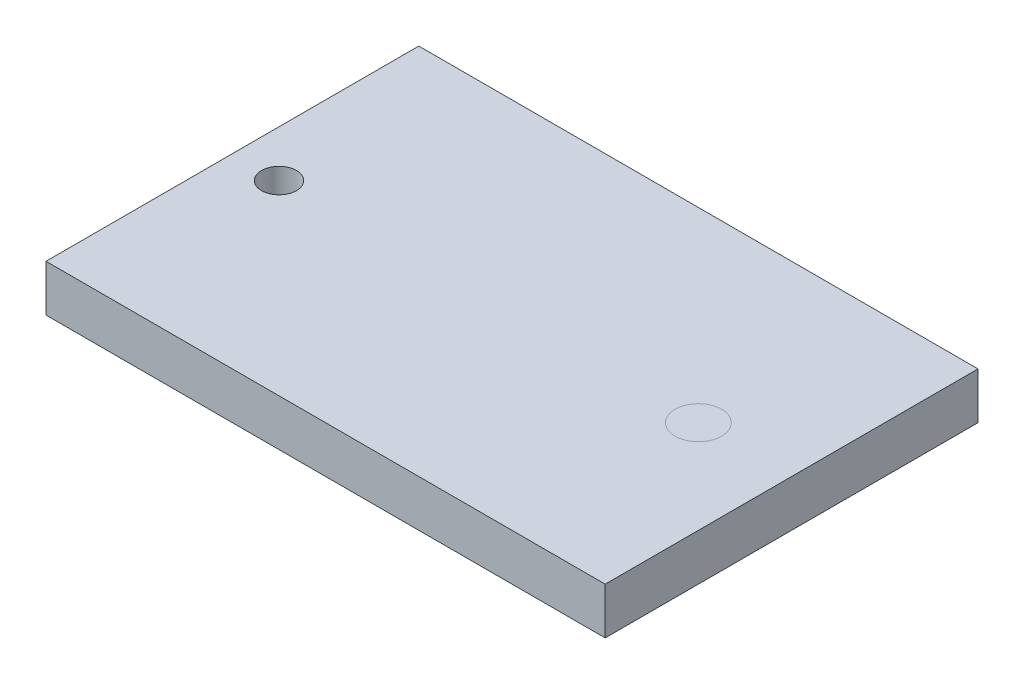
ISO-10303-21;
HEADER;
FILE_DESCRIPTION(('STEP AP214'),'2;1');
FILE_NAME('part.step','',(''),(''),'','','');
FILE_SCHEMA(('AUTOMOTIVE_DESIGN { 1 0 10303 214 1 1 1 1 }'));
ENDSEC;
DATA;
#1=APPLICATION_CONTEXT('core data for automotive mechanical design processes');
#2=APPLICATION_PROTOCOL_DEFINITION('international standard','automotive_design',2000,#1);
#3=PRODUCT_CONTEXT('',#1,'mechanical');
#4=PRODUCT('Part','Part','',(#3));
#5=PRODUCT_RELATED_PRODUCT_CATEGORY('part','',(#4));
#6=PRODUCT_DEFINITION_FORMATION('','',#4);
#7=PRODUCT_DEFINITION_CONTEXT('part definition',#1,'design');
#8=PRODUCT_DEFINITION('design','',#6,#7);
#9=PRODUCT_DEFINITION_SHAPE('','',#8);
#10=(LENGTH_UNIT() NAMED_UNIT(*) SI_UNIT(.MILLI.,.METRE.));
#11=(NAMED_UNIT(*) PLANE_ANGLE_UNIT() SI_UNIT($,.RADIAN.));
#12=(NAMED_UNIT(*) SI_UNIT($,.STERADIAN.) SOLID_ANGLE_UNIT());
#13=UNCERTAINTY_MEASURE_WITH_UNIT(LENGTH_MEASURE(1.E-05),#10,'distance_accuracy_value','');
#14=(GEOMETRIC_REPRESENTATION_CONTEXT(3) GLOBAL_UNCERTAINTY_ASSIGNED_CONTEXT((#13)) GLOBAL_UNIT_ASSIGNED_CONTEXT((#10,
#11,#12)) REPRESENTATION_CONTEXT('',''));
#15=CARTESIAN_POINT('',(0.,0.,0.));
#16=DIRECTION('',(0.,0.,1.));
#17=DIRECTION('',(1.,0.,0.));
#18=AXIS2_PLACEMENT_3D('',#15,#16,#17);
#19=CARTESIAN_POINT('',(0.,6.35,0.));
#20=DIRECTION('',(0.,1.,0.));
#21=DIRECTION('',(0.,0.,1.));
#22=AXIS2_PLACEMENT_3D('',#19,#20,#21);
#23=PLANE('',#22);
#24=DIRECTION('',(0.,0.,1.));
#25=VECTOR('',#24,1.);
#26=CARTESIAN_POINT('',(38.1,6.35,0.));
#27=LINE('',#26,#25);
#28=CARTESIAN_POINT('',(38.1,6.35,-25.4));
#29=VERTEX_POINT('',#28);
#30=CARTESIAN_POINT('',(38.1,6.35,25.4));
#31=VERTEX_POINT('',#30);
#32=EDGE_CURVE('E117',#29,#31,#27,.T.);
#33=ORIENTED_EDGE('',*,*,#32,.F.);
#34=DIRECTION('',(1.,0.,0.));
#35=VECTOR('',#34,1.);
#36=CARTESIAN_POINT('',(0.,6.35,-25.4));
#37=LINE('',#36,#35);
#38=CARTESIAN_POINT('',(-38.1,6.35,-25.4));
#39=VERTEX_POINT('',#38);
#40=EDGE_CURVE('E103',#39,#29,#37,.T.);
#41=ORIENTED_EDGE('',*,*,#40,.F.);
#42=DIRECTION('',(0.,0.,1.));
#43=VECTOR('',#42,1.);
#44=CARTESIAN_POINT('',(-38.1,6.35,0.));
#45=LINE('',#44,#43);
#46=CARTESIAN_POINT('',(-38.1,6.35,25.4));
#47=VERTEX_POINT('',#46);
#48=EDGE_CURVE('E112',#39,#47,#45,.T.);
#49=ORIENTED_EDGE('',*,*,#48,.T.);
#50=DIRECTION('',(1.,0.,0.));
#51=VECTOR('',#50,1.);
#52=CARTESIAN_POINT('',(0.,6.35,25.4));
#53=LINE('',#52,#51);
#54=EDGE_CURVE('E68',#47,#31,#53,.T.);
#55=ORIENTED_EDGE('',*,*,#54,.T.);
#56=EDGE_LOOP('',(#33,#41,#49,#55));
#57=FACE_BOUND('',#56,.T.);
#58=CARTESIAN_POINT('',(-31.75,6.35,0.));
#59=DIRECTION('',(0.,1.,0.));
#60=DIRECTION('',(0.,0.,1.));
#61=AXIS2_PLACEMENT_3D('',#58,#59,#60);
#62=CIRCLE('',#61,2.38125);
#63=CARTESIAN_POINT('',(-31.75,6.35,2.38125));
#64=VERTEX_POINT('',#63);
#65=EDGE_CURVE('E121',#64,#64,#62,.T.);
#66=ORIENTED_EDGE('',*,*,#65,.F.);
#67=EDGE_LOOP('',(#66));
#68=FACE_BOUND('',#67,.T.);
#69=CARTESIAN_POINT('',(25.4,6.35,0.));
#70=DIRECTION('',(0.,1.,0.));
#71=DIRECTION('',(0.,0.,1.));
#72=AXIS2_PLACEMENT_3D('',#69,#70,#71);
#73=CIRCLE('',#72,3.175);
#74=CARTESIAN_POINT('',(25.4,6.35,3.175));
#75=VERTEX_POINT('',#74);
#76=EDGE_CURVE('E12',#75,#75,#73,.F.);
#77=ORIENTED_EDGE('',*,*,#76,.T.);
#78=EDGE_LOOP('',(#77));
#79=FACE_BOUND('',#78,.T.);
#80=ADVANCED_FACE('F50',(#57,#68,#79),#23,.T.);
#81=CARTESIAN_POINT('',(38.1,6.35,0.));
#82=DIRECTION('',(1.,0.,0.));
#83=DIRECTION('',(0.,0.,-1.));
#84=AXIS2_PLACEMENT_3D('',#81,#82,#83);
#85=PLANE('',#84);
#86=DIRECTION('',(0.,0.,1.));
#87=VECTOR('',#86,1.);
#88=CARTESIAN_POINT('',(38.1,0.,0.));
#89=LINE('',#88,#87);
#90=CARTESIAN_POINT('',(38.1,0.,-25.4));
#91=VERTEX_POINT('',#90);
#92=CARTESIAN_POINT('',(38.1,0.,25.4));
#93=VERTEX_POINT('',#92);
#94=EDGE_CURVE('E131',#91,#93,#89,.T.);
#95=ORIENTED_EDGE('',*,*,#94,.F.);
#96=DIRECTION('',(0.,-1.,0.));
#97=VECTOR('',#96,1.);
#98=CARTESIAN_POINT('',(38.1,6.35,-25.4));
#99=LINE('',#98,#97);
#100=EDGE_CURVE('E60',#29,#91,#99,.T.);
#101=ORIENTED_EDGE('',*,*,#100,.F.);
#102=ORIENTED_EDGE('',*,*,#32,.T.);
#103=DIRECTION('',(0.,-1.,0.));
#104=VECTOR('',#103,1.);
#105=CARTESIAN_POINT('',(38.1,6.35,25.4));
#106=LINE('',#105,#104);
#107=EDGE_CURVE('E92',#31,#93,#106,.T.);
#108=ORIENTED_EDGE('',*,*,#107,.T.);
#109=EDGE_LOOP('',(#95,#101,#102,#108));
#110=FACE_BOUND('',#109,.T.);
#111=ADVANCED_FACE('F146',(#110),#85,.T.);
#112=CARTESIAN_POINT('',(0.,6.35,-25.4));
#113=DIRECTION('',(0.,0.,-1.));
#114=DIRECTION('',(-1.,0.,0.));
#115=AXIS2_PLACEMENT_3D('',#112,#113,#114);
#116=PLANE('',#115);
#117=DIRECTION('',(1.,0.,0.));
#118=VECTOR('',#117,1.);
#119=CARTESIAN_POINT('',(0.,0.,-25.4));
#120=LINE('',#119,#118);
#121=CARTESIAN_POINT('',(-38.1,0.,-25.4));
#122=VERTEX_POINT('',#121);
#123=EDGE_CURVE('E105',#122,#91,#120,.T.);
#124=ORIENTED_EDGE('',*,*,#123,.F.);
#125=DIRECTION('',(0.,-1.,0.));
#126=VECTOR('',#125,1.);
#127=CARTESIAN_POINT('',(-38.1,6.35,-25.4));
#128=LINE('',#127,#126);
#129=EDGE_CURVE('E99',#39,#122,#128,.T.);
#130=ORIENTED_EDGE('',*,*,#129,.F.);
#131=ORIENTED_EDGE('',*,*,#40,.T.);
#132=ORIENTED_EDGE('',*,*,#100,.T.);
#133=EDGE_LOOP('',(#124,#130,#131,#132));
#134=FACE_BOUND('',#133,.T.);
#135=ADVANCED_FACE('F101',(#134),#116,.T.);
#136=CARTESIAN_POINT('',(-38.1,6.35,0.));
#137=DIRECTION('',(1.,0.,0.));
#138=DIRECTION('',(0.,0.,-1.));
#139=AXIS2_PLACEMENT_3D('',#136,#137,#138);
#140=PLANE('',#139);
#141=DIRECTION('',(0.,0.,1.));
#142=VECTOR('',#141,1.);
#143=CARTESIAN_POINT('',(-38.1,0.,0.));
#144=LINE('',#143,#142);
#145=CARTESIAN_POINT('',(-38.1,0.,25.4));
#146=VERTEX_POINT('',#145);
#147=EDGE_CURVE('E136',#122,#146,#144,.T.);
#148=ORIENTED_EDGE('',*,*,#147,.T.);
#149=DIRECTION('',(0.,-1.,0.));
#150=VECTOR('',#149,1.);
#151=CARTESIAN_POINT('',(-38.1,6.35,25.4));
#152=LINE('',#151,#150);
#153=EDGE_CURVE('E109',#47,#146,#152,.T.);
#154=ORIENTED_EDGE('',*,*,#153,.F.);
#155=ORIENTED_EDGE('',*,*,#48,.F.);
#156=ORIENTED_EDGE('',*,*,#129,.T.);
#157=EDGE_LOOP('',(#148,#154,#155,#156));
#158=FACE_BOUND('',#157,.T.);
#159=ADVANCED_FACE('F113',(#158),#140,.F.);
#160=CARTESIAN_POINT('',(-31.75,6.35,0.));
#161=DIRECTION('',(0.,-1.,0.));
#162=DIRECTION('',(0.,0.,-1.));
#163=AXIS2_PLACEMENT_3D('',#160,#161,#162);
#164=CYLINDRICAL_SURFACE('',#163,2.38125);
#165=ORIENTED_EDGE('',*,*,#65,.T.);
#166=EDGE_LOOP('',(#165));
#167=FACE_BOUND('',#166,.T.);
#168=CARTESIAN_POINT('',(-31.75,0.,0.));
#169=DIRECTION('',(0.,1.,0.));
#170=DIRECTION('',(0.,0.,1.));
#171=AXIS2_PLACEMENT_3D('',#168,#169,#170);
#172=CIRCLE('',#171,2.38125);
#173=CARTESIAN_POINT('',(-31.75,0.,2.38125));
#174=VERTEX_POINT('',#173);
#175=EDGE_CURVE('E127',#174,#174,#172,.T.);
#176=ORIENTED_EDGE('',*,*,#175,.F.);
#177=EDGE_LOOP('',(#176));
#178=FACE_BOUND('',#177,.T.);
#179=ADVANCED_FACE('F52',(#167,#178),#164,.F.);
#180=CARTESIAN_POINT('',(0.,6.35,25.4));
#181=DIRECTION('',(0.,0.,-1.));
#182=DIRECTION('',(-1.,0.,0.));
#183=AXIS2_PLACEMENT_3D('',#180,#181,#182);
#184=PLANE('',#183);
#185=DIRECTION('',(1.,0.,0.));
#186=VECTOR('',#185,1.);
#187=CARTESIAN_POINT('',(0.,0.,25.4));
#188=LINE('',#187,#186);
#189=EDGE_CURVE('E85',#146,#93,#188,.T.);
#190=ORIENTED_EDGE('',*,*,#189,.T.);
#191=ORIENTED_EDGE('',*,*,#107,.F.);
#192=ORIENTED_EDGE('',*,*,#54,.F.);
#193=ORIENTED_EDGE('',*,*,#153,.T.);
#194=EDGE_LOOP('',(#190,#191,#192,#193));
#195=FACE_BOUND('',#194,.T.);
#196=ADVANCED_FACE('F155',(#195),#184,.F.);
#197=ORIENTED_EDGE('',*,*,#76,.F.);
#198=EDGE_LOOP('',(#197));
#199=FACE_BOUND('',#198,.T.);
#200=ADVANCED_FACE('F149',(#199),#23,.T.);
#201=CARTESIAN_POINT('',(0.,0.,0.));
#202=DIRECTION('',(0.,1.,0.));
#203=DIRECTION('',(0.,0.,1.));
#204=AXIS2_PLACEMENT_3D('',#201,#202,#203);
#205=PLANE('',#204);
#206=ORIENTED_EDGE('',*,*,#175,.T.);
#207=EDGE_LOOP('',(#206));
#208=FACE_BOUND('',#207,.T.);
#209=ORIENTED_EDGE('',*,*,#94,.T.);
#210=ORIENTED_EDGE('',*,*,#189,.F.);
#211=ORIENTED_EDGE('',*,*,#147,.F.);
#212=ORIENTED_EDGE('',*,*,#123,.T.);
#213=EDGE_LOOP('',(#209,#210,#211,#212));
#214=FACE_BOUND('',#213,.T.);
#215=ADVANCED_FACE('F147',(#208,#214),#205,.F.);
#216=CLOSED_SHELL('',(#80,#111,#135,#159,#179,#196,#200,#215));
#217=MANIFOLD_SOLID_BREP('B2',#216);
#218=ADVANCED_BREP_SHAPE_REPRESENTATION('',(#18,#217),#14);
#219=SHAPE_DEFINITION_REPRESENTATION(#9,#218);
ENDSEC;
END-ISO-10303-21;
